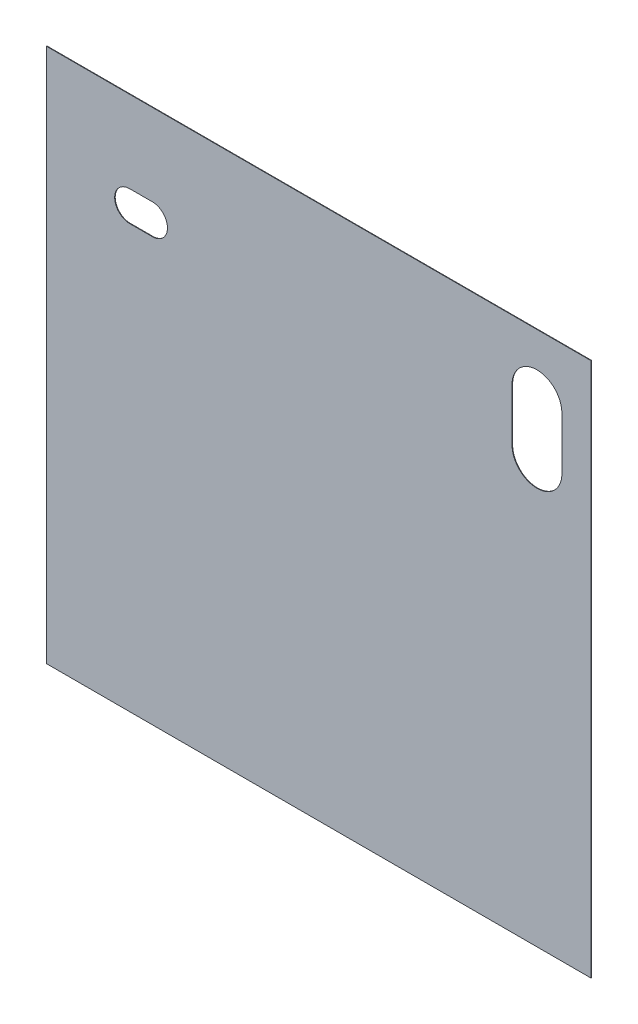
ISO-10303-21;
HEADER;
FILE_DESCRIPTION(('STEP AP214'),'2;1');
FILE_NAME('part.step','',(''),(''),'','','');
FILE_SCHEMA(('AUTOMOTIVE_DESIGN { 1 0 10303 214 1 1 1 1 }'));
ENDSEC;
DATA;
#1=APPLICATION_CONTEXT('core data for automotive mechanical design processes');
#2=APPLICATION_PROTOCOL_DEFINITION('international standard','automotive_design',2000,#1);
#3=PRODUCT_CONTEXT('',#1,'mechanical');
#4=PRODUCT('Part','Part','',(#3));
#5=PRODUCT_RELATED_PRODUCT_CATEGORY('part','',(#4));
#6=PRODUCT_DEFINITION_FORMATION('','',#4);
#7=PRODUCT_DEFINITION_CONTEXT('part definition',#1,'design');
#8=PRODUCT_DEFINITION('design','',#6,#7);
#9=PRODUCT_DEFINITION_SHAPE('','',#8);
#10=(LENGTH_UNIT() NAMED_UNIT(*) SI_UNIT(.MILLI.,.METRE.));
#11=(NAMED_UNIT(*) PLANE_ANGLE_UNIT() SI_UNIT($,.RADIAN.));
#12=(NAMED_UNIT(*) SI_UNIT($,.STERADIAN.) SOLID_ANGLE_UNIT());
#13=UNCERTAINTY_MEASURE_WITH_UNIT(LENGTH_MEASURE(1.E-05),#10,'distance_accuracy_value','');
#14=(GEOMETRIC_REPRESENTATION_CONTEXT(3) GLOBAL_UNCERTAINTY_ASSIGNED_CONTEXT((#13)) GLOBAL_UNIT_ASSIGNED_CONTEXT((#10,
#11,#12)) REPRESENTATION_CONTEXT('',''));
#15=CARTESIAN_POINT('',(0.,0.,0.));
#16=DIRECTION('',(0.,0.,1.));
#17=DIRECTION('',(1.,0.,0.));
#18=AXIS2_PLACEMENT_3D('',#15,#16,#17);
#19=CARTESIAN_POINT('',(0.,0.,0.5));
#20=DIRECTION('',(0.,0.,-1.));
#21=DIRECTION('',(-1.,0.,0.));
#22=AXIS2_PLACEMENT_3D('',#19,#20,#21);
#23=PLANE('',#22);
#24=DIRECTION('',(1.,0.,0.));
#25=VECTOR('',#24,1.);
#26=CARTESIAN_POINT('',(77.7857064757086,395.317767427199,0.5));
#27=LINE('',#26,#25);
#28=CARTESIAN_POINT('',(77.7857064757086,395.317767427199,0.5));
#29=VERTEX_POINT('',#28);
#30=CARTESIAN_POINT('',(98.9588969014612,395.317767427199,0.5));
#31=VERTEX_POINT('',#30);
#32=EDGE_CURVE('E134',#29,#31,#27,.T.);
#33=ORIENTED_EDGE('',*,*,#32,.F.);
#34=CARTESIAN_POINT('',(77.7857064757086,409.425150310526,0.5));
#35=DIRECTION('',(0.,0.,1.));
#36=DIRECTION('',(1.,0.,0.));
#37=AXIS2_PLACEMENT_3D('',#34,#35,#36);
#38=CIRCLE('',#37,14.107382883326);
#39=CARTESIAN_POINT('',(77.7857064757086,423.532533193852,0.5));
#40=VERTEX_POINT('',#39);
#41=EDGE_CURVE('E49',#40,#29,#38,.T.);
#42=ORIENTED_EDGE('',*,*,#41,.F.);
#43=DIRECTION('',(-1.,0.,0.));
#44=VECTOR('',#43,1.);
#45=CARTESIAN_POINT('',(77.7857064757086,423.532533193852,0.5));
#46=LINE('',#45,#44);
#47=CARTESIAN_POINT('',(98.9588969014612,423.532533193852,0.5));
#48=VERTEX_POINT('',#47);
#49=EDGE_CURVE('E140',#48,#40,#46,.T.);
#50=ORIENTED_EDGE('',*,*,#49,.F.);
#51=CARTESIAN_POINT('',(98.9588969014612,409.425150310526,0.5));
#52=DIRECTION('',(0.,0.,1.));
#53=DIRECTION('',(1.,0.,0.));
#54=AXIS2_PLACEMENT_3D('',#51,#52,#53);
#55=CIRCLE('',#54,14.107382883326);
#56=EDGE_CURVE('E125',#31,#48,#55,.T.);
#57=ORIENTED_EDGE('',*,*,#56,.F.);
#58=EDGE_LOOP('',(#33,#42,#50,#57));
#59=FACE_BOUND('',#58,.T.);
#60=DIRECTION('',(0.,-1.,0.));
#61=VECTOR('',#60,1.);
#62=CARTESIAN_POINT('',(0.,0.,0.5));
#63=LINE('',#62,#61);
#64=CARTESIAN_POINT('',(0.,500.,0.5));
#65=VERTEX_POINT('',#64);
#66=CARTESIAN_POINT('',(0.,0.,0.5));
#67=VERTEX_POINT('',#66);
#68=EDGE_CURVE('E181',#65,#67,#63,.T.);
#69=ORIENTED_EDGE('',*,*,#68,.T.);
#70=DIRECTION('',(1.,0.,0.));
#71=VECTOR('',#70,1.);
#72=CARTESIAN_POINT('',(0.,0.,0.5));
#73=LINE('',#72,#71);
#74=CARTESIAN_POINT('',(509.,0.,0.5));
#75=VERTEX_POINT('',#74);
#76=EDGE_CURVE('E184',#67,#75,#73,.T.);
#77=ORIENTED_EDGE('',*,*,#76,.T.);
#78=DIRECTION('',(0.,1.,0.));
#79=VECTOR('',#78,1.);
#80=CARTESIAN_POINT('',(509.,0.,0.5));
#81=LINE('',#80,#79);
#82=CARTESIAN_POINT('',(509.,500.,0.5));
#83=VERTEX_POINT('',#82);
#84=EDGE_CURVE('E187',#75,#83,#81,.T.);
#85=ORIENTED_EDGE('',*,*,#84,.T.);
#86=DIRECTION('',(-1.,0.,0.));
#87=VECTOR('',#86,1.);
#88=CARTESIAN_POINT('',(0.,500.,0.5));
#89=LINE('',#88,#87);
#90=EDGE_CURVE('E189',#83,#65,#89,.T.);
#91=ORIENTED_EDGE('',*,*,#90,.T.);
#92=EDGE_LOOP('',(#69,#77,#85,#91));
#93=FACE_BOUND('',#92,.T.);
#94=CARTESIAN_POINT('',(458.585000650592,444.006934605086,0.5));
#95=DIRECTION('',(0.,0.,1.));
#96=DIRECTION('',(1.,0.,0.));
#97=AXIS2_PLACEMENT_3D('',#94,#95,#96);
#98=CIRCLE('',#97,23.2800150280101);
#99=CARTESIAN_POINT('',(481.865015678602,444.006934605086,0.5));
#100=VERTEX_POINT('',#99);
#101=CARTESIAN_POINT('',(435.304985622581,444.006934605086,0.5));
#102=VERTEX_POINT('',#101);
#103=EDGE_CURVE('E150',#100,#102,#98,.T.);
#104=ORIENTED_EDGE('',*,*,#103,.F.);
#105=DIRECTION('',(0.,1.,0.));
#106=VECTOR('',#105,1.);
#107=CARTESIAN_POINT('',(481.865015678602,444.006934605086,0.5));
#108=LINE('',#107,#106);
#109=CARTESIAN_POINT('',(481.865015678602,394.675474188589,0.5));
#110=VERTEX_POINT('',#109);
#111=EDGE_CURVE('E158',#110,#100,#108,.T.);
#112=ORIENTED_EDGE('',*,*,#111,.F.);
#113=CARTESIAN_POINT('',(458.585000650592,394.675474188589,0.5));
#114=DIRECTION('',(0.,0.,1.));
#115=DIRECTION('',(1.,0.,0.));
#116=AXIS2_PLACEMENT_3D('',#113,#114,#115);
#117=CIRCLE('',#116,23.2800150280101);
#118=CARTESIAN_POINT('',(435.304985622581,394.675474188589,0.5));
#119=VERTEX_POINT('',#118);
#120=EDGE_CURVE('E155',#119,#110,#117,.T.);
#121=ORIENTED_EDGE('',*,*,#120,.F.);
#122=DIRECTION('',(0.,-1.,0.));
#123=VECTOR('',#122,1.);
#124=CARTESIAN_POINT('',(435.304985622581,444.006934605086,0.5));
#125=LINE('',#124,#123);
#126=EDGE_CURVE('E152',#102,#119,#125,.T.);
#127=ORIENTED_EDGE('',*,*,#126,.F.);
#128=EDGE_LOOP('',(#104,#112,#121,#127));
#129=FACE_BOUND('',#128,.T.);
#130=ADVANCED_FACE('F34',(#59,#93,#129),#23,.F.);
#131=CARTESIAN_POINT('',(0.,0.,0.));
#132=DIRECTION('',(0.,0.,-1.));
#133=DIRECTION('',(-1.,0.,0.));
#134=AXIS2_PLACEMENT_3D('',#131,#132,#133);
#135=PLANE('',#134);
#136=CARTESIAN_POINT('',(77.7857064757086,409.425150310526,0.));
#137=DIRECTION('',(0.,0.,-1.));
#138=DIRECTION('',(-1.,0.,0.));
#139=AXIS2_PLACEMENT_3D('',#136,#137,#138);
#140=CIRCLE('',#139,14.107382883326);
#141=CARTESIAN_POINT('',(77.7857064757086,395.317767427199,0.));
#142=VERTEX_POINT('',#141);
#143=CARTESIAN_POINT('',(77.7857064757086,423.532533193852,0.));
#144=VERTEX_POINT('',#143);
#145=EDGE_CURVE('E11',#142,#144,#140,.T.);
#146=ORIENTED_EDGE('',*,*,#145,.F.);
#147=DIRECTION('',(-1.,0.,0.));
#148=VECTOR('',#147,1.);
#149=CARTESIAN_POINT('',(0.,395.317767427199,0.));
#150=LINE('',#149,#148);
#151=CARTESIAN_POINT('',(98.9588969014612,395.317767427199,0.));
#152=VERTEX_POINT('',#151);
#153=EDGE_CURVE('E210',#152,#142,#150,.T.);
#154=ORIENTED_EDGE('',*,*,#153,.F.);
#155=CARTESIAN_POINT('',(98.9588969014612,409.425150310526,0.));
#156=DIRECTION('',(0.,0.,-1.));
#157=DIRECTION('',(-1.,0.,0.));
#158=AXIS2_PLACEMENT_3D('',#155,#156,#157);
#159=CIRCLE('',#158,14.107382883326);
#160=CARTESIAN_POINT('',(98.9588969014612,423.532533193852,0.));
#161=VERTEX_POINT('',#160);
#162=EDGE_CURVE('E128',#161,#152,#159,.T.);
#163=ORIENTED_EDGE('',*,*,#162,.F.);
#164=DIRECTION('',(1.,0.,0.));
#165=VECTOR('',#164,1.);
#166=CARTESIAN_POINT('',(0.,423.532533193852,0.));
#167=LINE('',#166,#165);
#168=EDGE_CURVE('E42',#144,#161,#167,.T.);
#169=ORIENTED_EDGE('',*,*,#168,.F.);
#170=EDGE_LOOP('',(#146,#154,#163,#169));
#171=FACE_BOUND('',#170,.T.);
#172=DIRECTION('',(0.,-1.,0.));
#173=VECTOR('',#172,1.);
#174=CARTESIAN_POINT('',(0.,0.,0.));
#175=LINE('',#174,#173);
#176=CARTESIAN_POINT('',(0.,500.,0.));
#177=VERTEX_POINT('',#176);
#178=CARTESIAN_POINT('',(0.,0.,0.));
#179=VERTEX_POINT('',#178);
#180=EDGE_CURVE('E180',#177,#179,#175,.T.);
#181=ORIENTED_EDGE('',*,*,#180,.F.);
#182=DIRECTION('',(-1.,0.,0.));
#183=VECTOR('',#182,1.);
#184=CARTESIAN_POINT('',(0.,500.,0.));
#185=LINE('',#184,#183);
#186=CARTESIAN_POINT('',(509.,500.,0.));
#187=VERTEX_POINT('',#186);
#188=EDGE_CURVE('E185',#187,#177,#185,.T.);
#189=ORIENTED_EDGE('',*,*,#188,.F.);
#190=DIRECTION('',(0.,1.,0.));
#191=VECTOR('',#190,1.);
#192=CARTESIAN_POINT('',(509.,0.,0.));
#193=LINE('',#192,#191);
#194=CARTESIAN_POINT('',(509.,0.,0.));
#195=VERTEX_POINT('',#194);
#196=EDGE_CURVE('E196',#195,#187,#193,.T.);
#197=ORIENTED_EDGE('',*,*,#196,.F.);
#198=DIRECTION('',(1.,0.,0.));
#199=VECTOR('',#198,1.);
#200=CARTESIAN_POINT('',(0.,0.,0.));
#201=LINE('',#200,#199);
#202=EDGE_CURVE('E194',#179,#195,#201,.T.);
#203=ORIENTED_EDGE('',*,*,#202,.F.);
#204=EDGE_LOOP('',(#181,#189,#197,#203));
#205=FACE_BOUND('',#204,.T.);
#206=DIRECTION('',(0.,1.,0.));
#207=VECTOR('',#206,1.);
#208=CARTESIAN_POINT('',(481.865015678602,444.006934605086,0.));
#209=LINE('',#208,#207);
#210=CARTESIAN_POINT('',(481.865015678602,394.675474188589,0.));
#211=VERTEX_POINT('',#210);
#212=CARTESIAN_POINT('',(481.865015678602,444.006934605086,0.));
#213=VERTEX_POINT('',#212);
#214=EDGE_CURVE('E153',#211,#213,#209,.T.);
#215=ORIENTED_EDGE('',*,*,#214,.T.);
#216=CARTESIAN_POINT('',(458.585000650592,444.006934605086,0.));
#217=DIRECTION('',(0.,0.,1.));
#218=DIRECTION('',(1.,0.,0.));
#219=AXIS2_PLACEMENT_3D('',#216,#217,#218);
#220=CIRCLE('',#219,23.2800150280101);
#221=CARTESIAN_POINT('',(435.304985622581,444.006934605086,0.));
#222=VERTEX_POINT('',#221);
#223=EDGE_CURVE('E147',#213,#222,#220,.T.);
#224=ORIENTED_EDGE('',*,*,#223,.T.);
#225=DIRECTION('',(0.,-1.,0.));
#226=VECTOR('',#225,1.);
#227=CARTESIAN_POINT('',(435.304985622581,444.006934605086,0.));
#228=LINE('',#227,#226);
#229=CARTESIAN_POINT('',(435.304985622581,394.675474188589,0.));
#230=VERTEX_POINT('',#229);
#231=EDGE_CURVE('E163',#222,#230,#228,.T.);
#232=ORIENTED_EDGE('',*,*,#231,.T.);
#233=CARTESIAN_POINT('',(458.585000650592,394.675474188589,0.));
#234=DIRECTION('',(0.,0.,1.));
#235=DIRECTION('',(1.,0.,0.));
#236=AXIS2_PLACEMENT_3D('',#233,#234,#235);
#237=CIRCLE('',#236,23.2800150280101);
#238=EDGE_CURVE('E166',#230,#211,#237,.T.);
#239=ORIENTED_EDGE('',*,*,#238,.T.);
#240=EDGE_LOOP('',(#215,#224,#232,#239));
#241=FACE_BOUND('',#240,.T.);
#242=ADVANCED_FACE('F218',(#171,#205,#241),#135,.T.);
#243=CARTESIAN_POINT('',(0.,0.,0.5));
#244=DIRECTION('',(1.,0.,0.));
#245=DIRECTION('',(0.,0.,-1.));
#246=AXIS2_PLACEMENT_3D('',#243,#244,#245);
#247=PLANE('',#246);
#248=ORIENTED_EDGE('',*,*,#180,.T.);
#249=DIRECTION('',(0.,0.,-1.));
#250=VECTOR('',#249,1.);
#251=CARTESIAN_POINT('',(0.,0.,0.5));
#252=LINE('',#251,#250);
#253=EDGE_CURVE('E207',#67,#179,#252,.T.);
#254=ORIENTED_EDGE('',*,*,#253,.F.);
#255=ORIENTED_EDGE('',*,*,#68,.F.);
#256=DIRECTION('',(0.,0.,-1.));
#257=VECTOR('',#256,1.);
#258=CARTESIAN_POINT('',(0.,500.,0.5));
#259=LINE('',#258,#257);
#260=EDGE_CURVE('E191',#65,#177,#259,.T.);
#261=ORIENTED_EDGE('',*,*,#260,.T.);
#262=EDGE_LOOP('',(#248,#254,#255,#261));
#263=FACE_BOUND('',#262,.T.);
#264=ADVANCED_FACE('F36',(#263),#247,.F.);
#265=CARTESIAN_POINT('',(0.,0.,0.5));
#266=DIRECTION('',(0.,1.,0.));
#267=DIRECTION('',(0.,0.,1.));
#268=AXIS2_PLACEMENT_3D('',#265,#266,#267);
#269=PLANE('',#268);
#270=ORIENTED_EDGE('',*,*,#202,.T.);
#271=DIRECTION('',(0.,0.,-1.));
#272=VECTOR('',#271,1.);
#273=CARTESIAN_POINT('',(509.,0.,0.5));
#274=LINE('',#273,#272);
#275=EDGE_CURVE('E204',#75,#195,#274,.T.);
#276=ORIENTED_EDGE('',*,*,#275,.F.);
#277=ORIENTED_EDGE('',*,*,#76,.F.);
#278=ORIENTED_EDGE('',*,*,#253,.T.);
#279=EDGE_LOOP('',(#270,#276,#277,#278));
#280=FACE_BOUND('',#279,.T.);
#281=ADVANCED_FACE('F249',(#280),#269,.F.);
#282=CARTESIAN_POINT('',(509.,0.,0.5));
#283=DIRECTION('',(-1.,0.,0.));
#284=DIRECTION('',(0.,0.,1.));
#285=AXIS2_PLACEMENT_3D('',#282,#283,#284);
#286=PLANE('',#285);
#287=ORIENTED_EDGE('',*,*,#196,.T.);
#288=DIRECTION('',(0.,0.,-1.));
#289=VECTOR('',#288,1.);
#290=CARTESIAN_POINT('',(509.,500.,0.5));
#291=LINE('',#290,#289);
#292=EDGE_CURVE('E201',#83,#187,#291,.T.);
#293=ORIENTED_EDGE('',*,*,#292,.F.);
#294=ORIENTED_EDGE('',*,*,#84,.F.);
#295=ORIENTED_EDGE('',*,*,#275,.T.);
#296=EDGE_LOOP('',(#287,#293,#294,#295));
#297=FACE_BOUND('',#296,.T.);
#298=ADVANCED_FACE('F246',(#297),#286,.F.);
#299=CARTESIAN_POINT('',(0.,500.,0.5));
#300=DIRECTION('',(0.,-1.,0.));
#301=DIRECTION('',(0.,0.,-1.));
#302=AXIS2_PLACEMENT_3D('',#299,#300,#301);
#303=PLANE('',#302);
#304=ORIENTED_EDGE('',*,*,#188,.T.);
#305=ORIENTED_EDGE('',*,*,#260,.F.);
#306=ORIENTED_EDGE('',*,*,#90,.F.);
#307=ORIENTED_EDGE('',*,*,#292,.T.);
#308=EDGE_LOOP('',(#304,#305,#306,#307));
#309=FACE_BOUND('',#308,.T.);
#310=ADVANCED_FACE('F243',(#309),#303,.F.);
#311=CARTESIAN_POINT('',(458.585000650592,444.006934605086,0.5));
#312=DIRECTION('',(0.,0.,-1.));
#313=DIRECTION('',(-1.,0.,0.));
#314=AXIS2_PLACEMENT_3D('',#311,#312,#313);
#315=CYLINDRICAL_SURFACE('',#314,23.2800150280101);
#316=ORIENTED_EDGE('',*,*,#223,.F.);
#317=DIRECTION('',(0.,0.,-1.));
#318=VECTOR('',#317,1.);
#319=CARTESIAN_POINT('',(481.865015678602,444.006934605086,0.5));
#320=LINE('',#319,#318);
#321=EDGE_CURVE('E160',#100,#213,#320,.T.);
#322=ORIENTED_EDGE('',*,*,#321,.F.);
#323=ORIENTED_EDGE('',*,*,#103,.T.);
#324=DIRECTION('',(0.,0.,-1.));
#325=VECTOR('',#324,1.);
#326=CARTESIAN_POINT('',(435.304985622581,444.006934605086,0.5));
#327=LINE('',#326,#325);
#328=EDGE_CURVE('E177',#102,#222,#327,.T.);
#329=ORIENTED_EDGE('',*,*,#328,.T.);
#330=EDGE_LOOP('',(#316,#322,#323,#329));
#331=FACE_BOUND('',#330,.T.);
#332=ADVANCED_FACE('F240',(#331),#315,.F.);
#333=CARTESIAN_POINT('',(435.304985622581,444.006934605086,0.5));
#334=DIRECTION('',(1.,0.,0.));
#335=DIRECTION('',(0.,0.,-1.));
#336=AXIS2_PLACEMENT_3D('',#333,#334,#335);
#337=PLANE('',#336);
#338=ORIENTED_EDGE('',*,*,#231,.F.);
#339=ORIENTED_EDGE('',*,*,#328,.F.);
#340=ORIENTED_EDGE('',*,*,#126,.T.);
#341=DIRECTION('',(0.,0.,-1.));
#342=VECTOR('',#341,1.);
#343=CARTESIAN_POINT('',(435.304985622581,394.675474188589,0.5));
#344=LINE('',#343,#342);
#345=EDGE_CURVE('E175',#119,#230,#344,.T.);
#346=ORIENTED_EDGE('',*,*,#345,.T.);
#347=EDGE_LOOP('',(#338,#339,#340,#346));
#348=FACE_BOUND('',#347,.T.);
#349=ADVANCED_FACE('F277',(#348),#337,.T.);
#350=CARTESIAN_POINT('',(458.585000650592,394.675474188589,0.5));
#351=DIRECTION('',(0.,0.,-1.));
#352=DIRECTION('',(-1.,0.,0.));
#353=AXIS2_PLACEMENT_3D('',#350,#351,#352);
#354=CYLINDRICAL_SURFACE('',#353,23.2800150280101);
#355=ORIENTED_EDGE('',*,*,#238,.F.);
#356=ORIENTED_EDGE('',*,*,#345,.F.);
#357=ORIENTED_EDGE('',*,*,#120,.T.);
#358=DIRECTION('',(0.,0.,-1.));
#359=VECTOR('',#358,1.);
#360=CARTESIAN_POINT('',(481.865015678602,394.675474188589,0.5));
#361=LINE('',#360,#359);
#362=EDGE_CURVE('E173',#110,#211,#361,.T.);
#363=ORIENTED_EDGE('',*,*,#362,.T.);
#364=EDGE_LOOP('',(#355,#356,#357,#363));
#365=FACE_BOUND('',#364,.T.);
#366=ADVANCED_FACE('F229',(#365),#354,.F.);
#367=CARTESIAN_POINT('',(481.865015678602,444.006934605086,0.5));
#368=DIRECTION('',(-1.,0.,0.));
#369=DIRECTION('',(0.,0.,1.));
#370=AXIS2_PLACEMENT_3D('',#367,#368,#369);
#371=PLANE('',#370);
#372=ORIENTED_EDGE('',*,*,#214,.F.);
#373=ORIENTED_EDGE('',*,*,#362,.F.);
#374=ORIENTED_EDGE('',*,*,#111,.T.);
#375=ORIENTED_EDGE('',*,*,#321,.T.);
#376=EDGE_LOOP('',(#372,#373,#374,#375));
#377=FACE_BOUND('',#376,.T.);
#378=ADVANCED_FACE('F222',(#377),#371,.T.);
#379=CARTESIAN_POINT('',(77.7857064757086,409.425150310526,-9.5));
#380=DIRECTION('',(0.,0.,1.));
#381=DIRECTION('',(1.,0.,0.));
#382=AXIS2_PLACEMENT_3D('',#379,#380,#381);
#383=CYLINDRICAL_SURFACE('',#382,14.107382883326);
#384=ORIENTED_EDGE('',*,*,#145,.T.);
#385=DIRECTION('',(0.,0.,1.));
#386=VECTOR('',#385,1.);
#387=CARTESIAN_POINT('',(77.7857064757086,423.532533193852,-9.5));
#388=LINE('',#387,#386);
#389=EDGE_CURVE('E145',#144,#40,#388,.T.);
#390=ORIENTED_EDGE('',*,*,#389,.T.);
#391=ORIENTED_EDGE('',*,*,#41,.T.);
#392=DIRECTION('',(0.,0.,1.));
#393=VECTOR('',#392,1.);
#394=CARTESIAN_POINT('',(77.7857064757086,395.317767427199,-9.5));
#395=LINE('',#394,#393);
#396=EDGE_CURVE('E131',#142,#29,#395,.T.);
#397=ORIENTED_EDGE('',*,*,#396,.F.);
#398=EDGE_LOOP('',(#384,#390,#391,#397));
#399=FACE_BOUND('',#398,.T.);
#400=ADVANCED_FACE('F220',(#399),#383,.F.);
#401=CARTESIAN_POINT('',(77.7857064757086,423.532533193852,-9.5));
#402=DIRECTION('',(0.,1.,0.));
#403=DIRECTION('',(0.,0.,1.));
#404=AXIS2_PLACEMENT_3D('',#401,#402,#403);
#405=PLANE('',#404);
#406=ORIENTED_EDGE('',*,*,#168,.T.);
#407=DIRECTION('',(0.,0.,1.));
#408=VECTOR('',#407,1.);
#409=CARTESIAN_POINT('',(98.9588969014612,423.532533193852,-9.5));
#410=LINE('',#409,#408);
#411=EDGE_CURVE('E130',#161,#48,#410,.T.);
#412=ORIENTED_EDGE('',*,*,#411,.T.);
#413=ORIENTED_EDGE('',*,*,#49,.T.);
#414=ORIENTED_EDGE('',*,*,#389,.F.);
#415=EDGE_LOOP('',(#406,#412,#413,#414));
#416=FACE_BOUND('',#415,.T.);
#417=ADVANCED_FACE('F215',(#416),#405,.F.);
#418=CARTESIAN_POINT('',(98.9588969014612,409.425150310526,-9.5));
#419=DIRECTION('',(0.,0.,1.));
#420=DIRECTION('',(1.,0.,0.));
#421=AXIS2_PLACEMENT_3D('',#418,#419,#420);
#422=CYLINDRICAL_SURFACE('',#421,14.107382883326);
#423=ORIENTED_EDGE('',*,*,#162,.T.);
#424=DIRECTION('',(0.,0.,1.));
#425=VECTOR('',#424,1.);
#426=CARTESIAN_POINT('',(98.9588969014612,395.317767427199,-9.5));
#427=LINE('',#426,#425);
#428=EDGE_CURVE('E57',#152,#31,#427,.T.);
#429=ORIENTED_EDGE('',*,*,#428,.T.);
#430=ORIENTED_EDGE('',*,*,#56,.T.);
#431=ORIENTED_EDGE('',*,*,#411,.F.);
#432=EDGE_LOOP('',(#423,#429,#430,#431));
#433=FACE_BOUND('',#432,.T.);
#434=ADVANCED_FACE('F122',(#433),#422,.F.);
#435=CARTESIAN_POINT('',(77.7857064757086,395.317767427199,-9.5));
#436=DIRECTION('',(0.,-1.,0.));
#437=DIRECTION('',(0.,0.,-1.));
#438=AXIS2_PLACEMENT_3D('',#435,#436,#437);
#439=PLANE('',#438);
#440=ORIENTED_EDGE('',*,*,#153,.T.);
#441=ORIENTED_EDGE('',*,*,#396,.T.);
#442=ORIENTED_EDGE('',*,*,#32,.T.);
#443=ORIENTED_EDGE('',*,*,#428,.F.);
#444=EDGE_LOOP('',(#440,#441,#442,#443));
#445=FACE_BOUND('',#444,.T.);
#446=ADVANCED_FACE('F135',(#445),#439,.F.);
#447=CLOSED_SHELL('',(#130,#242,#264,#281,#298,#310,#332,#349,#366,#378,#400,#417,#434,#446));
#448=MANIFOLD_SOLID_BREP('B2',#447);
#449=ADVANCED_BREP_SHAPE_REPRESENTATION('',(#18,#448),#14);
#450=SHAPE_DEFINITION_REPRESENTATION(#9,#449);
ENDSEC;
END-ISO-10303-21;
